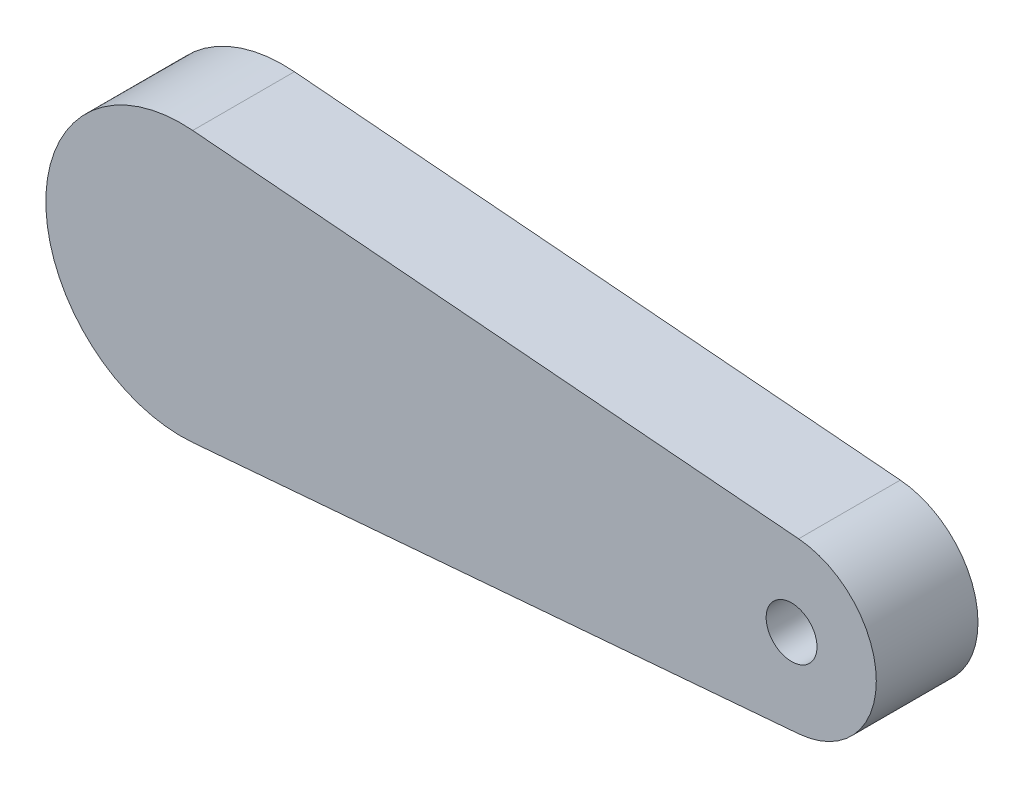
ISO-10303-21;
HEADER;
FILE_DESCRIPTION(('STEP AP214'),'2;1');
FILE_NAME('part.step','',(''),(''),'','','');
FILE_SCHEMA(('AUTOMOTIVE_DESIGN { 1 0 10303 214 1 1 1 1 }'));
ENDSEC;
DATA;
#1=APPLICATION_CONTEXT('core data for automotive mechanical design processes');
#2=APPLICATION_PROTOCOL_DEFINITION('international standard','automotive_design',2000,#1);
#3=PRODUCT_CONTEXT('',#1,'mechanical');
#4=PRODUCT('Part','Part','',(#3));
#5=PRODUCT_RELATED_PRODUCT_CATEGORY('part','',(#4));
#6=PRODUCT_DEFINITION_FORMATION('','',#4);
#7=PRODUCT_DEFINITION_CONTEXT('part definition',#1,'design');
#8=PRODUCT_DEFINITION('design','',#6,#7);
#9=PRODUCT_DEFINITION_SHAPE('','',#8);
#10=(LENGTH_UNIT() NAMED_UNIT(*) SI_UNIT(.MILLI.,.METRE.));
#11=(NAMED_UNIT(*) PLANE_ANGLE_UNIT() SI_UNIT($,.RADIAN.));
#12=(NAMED_UNIT(*) SI_UNIT($,.STERADIAN.) SOLID_ANGLE_UNIT());
#13=UNCERTAINTY_MEASURE_WITH_UNIT(LENGTH_MEASURE(1.E-05),#10,'distance_accuracy_value','');
#14=(GEOMETRIC_REPRESENTATION_CONTEXT(3) GLOBAL_UNCERTAINTY_ASSIGNED_CONTEXT((#13)) GLOBAL_UNIT_ASSIGNED_CONTEXT((#10,
#11,#12)) REPRESENTATION_CONTEXT('',''));
#15=CARTESIAN_POINT('',(0.,0.,0.));
#16=DIRECTION('',(0.,0.,1.));
#17=DIRECTION('',(1.,0.,0.));
#18=AXIS2_PLACEMENT_3D('',#15,#16,#17);
#19=CARTESIAN_POINT('',(0.,0.,30.));
#20=DIRECTION('',(0.,0.,-1.));
#21=DIRECTION('',(-1.,0.,0.));
#22=AXIS2_PLACEMENT_3D('',#19,#20,#21);
#23=CYLINDRICAL_SURFACE('',#22,40.);
#24=CARTESIAN_POINT('',(0.,0.,0.));
#25=DIRECTION('',(0.,0.,1.));
#26=DIRECTION('',(1.,0.,0.));
#27=AXIS2_PLACEMENT_3D('',#24,#25,#26);
#28=CIRCLE('',#27,40.);
#29=CARTESIAN_POINT('',(3.33333333333333,39.8608691436713,0.));
#30=VERTEX_POINT('',#29);
#31=CARTESIAN_POINT('',(3.33333333333333,-39.8608691436713,0.));
#32=VERTEX_POINT('',#31);
#33=EDGE_CURVE('E99',#30,#32,#28,.T.);
#34=ORIENTED_EDGE('',*,*,#33,.T.);
#35=DIRECTION('',(0.,0.,-1.));
#36=VECTOR('',#35,1.);
#37=CARTESIAN_POINT('',(3.33333333333333,-39.8608691436713,30.));
#38=LINE('',#37,#36);
#39=CARTESIAN_POINT('',(3.33333333333333,-39.8608691436713,30.));
#40=VERTEX_POINT('',#39);
#41=EDGE_CURVE('E11',#40,#32,#38,.T.);
#42=ORIENTED_EDGE('',*,*,#41,.F.);
#43=CARTESIAN_POINT('',(0.,0.,30.));
#44=DIRECTION('',(0.,0.,1.));
#45=DIRECTION('',(1.,0.,0.));
#46=AXIS2_PLACEMENT_3D('',#43,#44,#45);
#47=CIRCLE('',#46,40.);
#48=CARTESIAN_POINT('',(3.33333333333333,39.8608691436713,30.));
#49=VERTEX_POINT('',#48);
#50=EDGE_CURVE('E86',#49,#40,#47,.T.);
#51=ORIENTED_EDGE('',*,*,#50,.F.);
#52=DIRECTION('',(0.,0.,-1.));
#53=VECTOR('',#52,1.);
#54=CARTESIAN_POINT('',(3.33333333333333,39.8608691436713,30.));
#55=LINE('',#54,#53);
#56=EDGE_CURVE('E95',#49,#30,#55,.T.);
#57=ORIENTED_EDGE('',*,*,#56,.T.);
#58=EDGE_LOOP('',(#34,#42,#51,#57));
#59=FACE_BOUND('',#58,.T.);
#60=ADVANCED_FACE('F34',(#59),#23,.T.);
#61=CARTESIAN_POINT('',(3.33333333333333,-39.8608691436713,30.));
#62=DIRECTION('',(-0.0833333333333333,0.996521728591783,0.));
#63=DIRECTION('',(-0.996521728591783,-0.0833333333333333,0.));
#64=AXIS2_PLACEMENT_3D('',#61,#62,#63);
#65=PLANE('',#64);
#66=DIRECTION('',(0.996521728591783,0.0833333333333333,0.));
#67=VECTOR('',#66,1.);
#68=CARTESIAN_POINT('',(3.33333333333333,-39.8608691436713,0.));
#69=LINE('',#68,#67);
#70=CARTESIAN_POINT('',(182.083333333333,-24.9130432147946,0.));
#71=VERTEX_POINT('',#70);
#72=EDGE_CURVE('E90',#32,#71,#69,.T.);
#73=ORIENTED_EDGE('',*,*,#72,.T.);
#74=DIRECTION('',(0.,0.,-1.));
#75=VECTOR('',#74,1.);
#76=CARTESIAN_POINT('',(182.083333333333,-24.9130432147946,30.));
#77=LINE('',#76,#75);
#78=CARTESIAN_POINT('',(182.083333333333,-24.9130432147946,30.));
#79=VERTEX_POINT('',#78);
#80=EDGE_CURVE('E43',#79,#71,#77,.T.);
#81=ORIENTED_EDGE('',*,*,#80,.F.);
#82=DIRECTION('',(0.996521728591783,0.0833333333333333,0.));
#83=VECTOR('',#82,1.);
#84=CARTESIAN_POINT('',(3.33333333333333,-39.8608691436713,30.));
#85=LINE('',#84,#83);
#86=EDGE_CURVE('E81',#40,#79,#85,.T.);
#87=ORIENTED_EDGE('',*,*,#86,.F.);
#88=ORIENTED_EDGE('',*,*,#41,.T.);
#89=EDGE_LOOP('',(#73,#81,#87,#88));
#90=FACE_BOUND('',#89,.T.);
#91=ADVANCED_FACE('F89',(#90),#65,.F.);
#92=CARTESIAN_POINT('',(180.,0.,30.));
#93=DIRECTION('',(0.,0.,-1.));
#94=DIRECTION('',(-1.,0.,0.));
#95=AXIS2_PLACEMENT_3D('',#92,#93,#94);
#96=CYLINDRICAL_SURFACE('',#95,25.);
#97=CARTESIAN_POINT('',(180.,0.,0.));
#98=DIRECTION('',(0.,0.,1.));
#99=DIRECTION('',(1.,0.,0.));
#100=AXIS2_PLACEMENT_3D('',#97,#98,#99);
#101=CIRCLE('',#100,25.);
#102=CARTESIAN_POINT('',(182.083333333333,24.9130432147946,0.));
#103=VERTEX_POINT('',#102);
#104=EDGE_CURVE('E68',#71,#103,#101,.T.);
#105=ORIENTED_EDGE('',*,*,#104,.T.);
#106=DIRECTION('',(0.,0.,-1.));
#107=VECTOR('',#106,1.);
#108=CARTESIAN_POINT('',(182.083333333333,24.9130432147946,30.));
#109=LINE('',#108,#107);
#110=CARTESIAN_POINT('',(182.083333333333,24.9130432147946,30.));
#111=VERTEX_POINT('',#110);
#112=EDGE_CURVE('E91',#111,#103,#109,.T.);
#113=ORIENTED_EDGE('',*,*,#112,.F.);
#114=CARTESIAN_POINT('',(180.,0.,30.));
#115=DIRECTION('',(0.,0.,1.));
#116=DIRECTION('',(1.,0.,0.));
#117=AXIS2_PLACEMENT_3D('',#114,#115,#116);
#118=CIRCLE('',#117,25.);
#119=EDGE_CURVE('E84',#79,#111,#118,.T.);
#120=ORIENTED_EDGE('',*,*,#119,.F.);
#121=ORIENTED_EDGE('',*,*,#80,.T.);
#122=EDGE_LOOP('',(#105,#113,#120,#121));
#123=FACE_BOUND('',#122,.T.);
#124=ADVANCED_FACE('F93',(#123),#96,.T.);
#125=CARTESIAN_POINT('',(3.33333333333333,39.8608691436713,30.));
#126=DIRECTION('',(-0.0833333333333333,-0.996521728591783,0.));
#127=DIRECTION('',(0.996521728591783,-0.0833333333333333,0.));
#128=AXIS2_PLACEMENT_3D('',#125,#126,#127);
#129=PLANE('',#128);
#130=DIRECTION('',(-0.996521728591783,0.0833333333333333,0.));
#131=VECTOR('',#130,1.);
#132=CARTESIAN_POINT('',(3.33333333333333,39.8608691436713,0.));
#133=LINE('',#132,#131);
#134=EDGE_CURVE('E74',#103,#30,#133,.T.);
#135=ORIENTED_EDGE('',*,*,#134,.T.);
#136=ORIENTED_EDGE('',*,*,#56,.F.);
#137=DIRECTION('',(-0.996521728591783,0.0833333333333333,0.));
#138=VECTOR('',#137,1.);
#139=CARTESIAN_POINT('',(3.33333333333333,39.8608691436713,30.));
#140=LINE('',#139,#138);
#141=EDGE_CURVE('E51',#111,#49,#140,.T.);
#142=ORIENTED_EDGE('',*,*,#141,.F.);
#143=ORIENTED_EDGE('',*,*,#112,.T.);
#144=EDGE_LOOP('',(#135,#136,#142,#143));
#145=FACE_BOUND('',#144,.T.);
#146=ADVANCED_FACE('F107',(#145),#129,.F.);
#147=CARTESIAN_POINT('',(0.,0.,30.));
#148=DIRECTION('',(0.,0.,1.));
#149=DIRECTION('',(1.,0.,0.));
#150=AXIS2_PLACEMENT_3D('',#147,#148,#149);
#151=PLANE('',#150);
#152=CARTESIAN_POINT('',(180.,0.,30.));
#153=DIRECTION('',(0.,0.,1.));
#154=DIRECTION('',(1.,0.,0.));
#155=AXIS2_PLACEMENT_3D('',#152,#153,#154);
#156=CIRCLE('',#155,7.50000000000001);
#157=CARTESIAN_POINT('',(187.5,0.,30.));
#158=VERTEX_POINT('',#157);
#159=EDGE_CURVE('E118',#158,#158,#156,.T.);
#160=ORIENTED_EDGE('',*,*,#159,.F.);
#161=EDGE_LOOP('',(#160));
#162=FACE_BOUND('',#161,.T.);
#163=ORIENTED_EDGE('',*,*,#50,.T.);
#164=ORIENTED_EDGE('',*,*,#86,.T.);
#165=ORIENTED_EDGE('',*,*,#119,.T.);
#166=ORIENTED_EDGE('',*,*,#141,.T.);
#167=EDGE_LOOP('',(#163,#164,#165,#166));
#168=FACE_BOUND('',#167,.T.);
#169=ADVANCED_FACE('F82',(#162,#168),#151,.T.);
#170=CARTESIAN_POINT('',(0.,0.,0.));
#171=DIRECTION('',(0.,0.,1.));
#172=DIRECTION('',(1.,0.,0.));
#173=AXIS2_PLACEMENT_3D('',#170,#171,#172);
#174=PLANE('',#173);
#175=CARTESIAN_POINT('',(180.,0.,0.));
#176=DIRECTION('',(0.,0.,1.));
#177=DIRECTION('',(1.,0.,0.));
#178=AXIS2_PLACEMENT_3D('',#175,#176,#177);
#179=CIRCLE('',#178,7.50000000000001);
#180=CARTESIAN_POINT('',(187.5,0.,0.));
#181=VERTEX_POINT('',#180);
#182=EDGE_CURVE('E37',#181,#181,#179,.T.);
#183=ORIENTED_EDGE('',*,*,#182,.T.);
#184=EDGE_LOOP('',(#183));
#185=FACE_BOUND('',#184,.T.);
#186=CARTESIAN_POINT('',(0.,0.,0.));
#187=DIRECTION('',(0.,0.,-1.));
#188=DIRECTION('',(-1.,0.,0.));
#189=AXIS2_PLACEMENT_3D('',#186,#187,#188);
#190=CIRCLE('',#189,5.);
#191=CARTESIAN_POINT('',(-5.,0.,0.));
#192=VERTEX_POINT('',#191);
#193=EDGE_CURVE('E113',#192,#192,#190,.T.);
#194=ORIENTED_EDGE('',*,*,#193,.F.);
#195=EDGE_LOOP('',(#194));
#196=FACE_BOUND('',#195,.T.);
#197=ORIENTED_EDGE('',*,*,#33,.F.);
#198=ORIENTED_EDGE('',*,*,#134,.F.);
#199=ORIENTED_EDGE('',*,*,#104,.F.);
#200=ORIENTED_EDGE('',*,*,#72,.F.);
#201=EDGE_LOOP('',(#197,#198,#199,#200));
#202=FACE_BOUND('',#201,.T.);
#203=ADVANCED_FACE('F110',(#185,#196,#202),#174,.F.);
#204=CARTESIAN_POINT('',(0.,0.,10.));
#205=DIRECTION('',(0.,0.,-1.));
#206=DIRECTION('',(-1.,0.,0.));
#207=AXIS2_PLACEMENT_3D('',#204,#205,#206);
#208=CYLINDRICAL_SURFACE('',#207,5.);
#209=CARTESIAN_POINT('',(0.,0.,10.));
#210=DIRECTION('',(0.,0.,-1.));
#211=DIRECTION('',(-1.,0.,0.));
#212=AXIS2_PLACEMENT_3D('',#209,#210,#211);
#213=CIRCLE('',#212,5.);
#214=CARTESIAN_POINT('',(-5.,0.,10.));
#215=VERTEX_POINT('',#214);
#216=EDGE_CURVE('E102',#215,#215,#213,.T.);
#217=ORIENTED_EDGE('',*,*,#216,.F.);
#218=EDGE_LOOP('',(#217));
#219=FACE_BOUND('',#218,.T.);
#220=ORIENTED_EDGE('',*,*,#193,.T.);
#221=EDGE_LOOP('',(#220));
#222=FACE_BOUND('',#221,.T.);
#223=ADVANCED_FACE('F134',(#219,#222),#208,.F.);
#224=CARTESIAN_POINT('',(0.,0.,10.));
#225=DIRECTION('',(0.,0.,-1.));
#226=DIRECTION('',(-1.,0.,0.));
#227=AXIS2_PLACEMENT_3D('',#224,#225,#226);
#228=PLANE('',#227);
#229=ORIENTED_EDGE('',*,*,#216,.T.);
#230=EDGE_LOOP('',(#229));
#231=FACE_BOUND('',#230,.T.);
#232=ADVANCED_FACE('F129',(#231),#228,.T.);
#233=CARTESIAN_POINT('',(180.,0.,-39.));
#234=DIRECTION('',(0.,0.,1.));
#235=DIRECTION('',(1.,0.,0.));
#236=AXIS2_PLACEMENT_3D('',#233,#234,#235);
#237=CYLINDRICAL_SURFACE('',#236,7.50000000000001);
#238=ORIENTED_EDGE('',*,*,#159,.T.);
#239=EDGE_LOOP('',(#238));
#240=FACE_BOUND('',#239,.T.);
#241=ORIENTED_EDGE('',*,*,#182,.F.);
#242=EDGE_LOOP('',(#241));
#243=FACE_BOUND('',#242,.T.);
#244=ADVANCED_FACE('F127',(#240,#243),#237,.F.);
#245=CLOSED_SHELL('',(#60,#91,#124,#146,#169,#203,#223,#232,#244));
#246=MANIFOLD_SOLID_BREP('B2',#245);
#247=ADVANCED_BREP_SHAPE_REPRESENTATION('',(#18,#246),#14);
#248=SHAPE_DEFINITION_REPRESENTATION(#9,#247);
ENDSEC;
END-ISO-10303-21;
